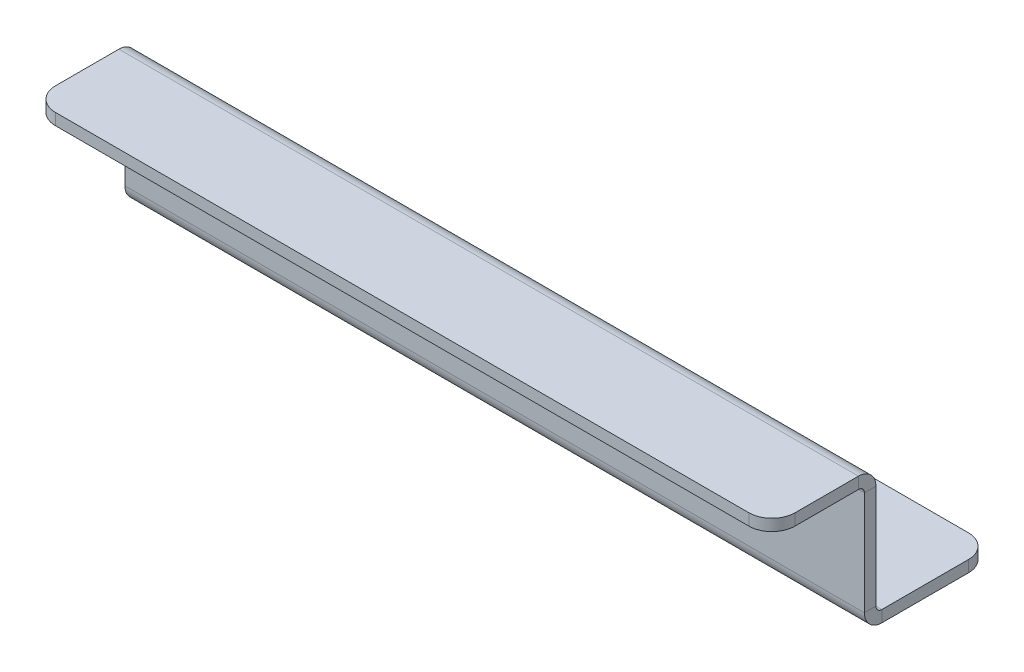
ISO-10303-21;
HEADER;
FILE_DESCRIPTION(('STEP AP214'),'2;1');
FILE_NAME('part.step','',(''),(''),'','','');
FILE_SCHEMA(('AUTOMOTIVE_DESIGN { 1 0 10303 214 1 1 1 1 }'));
ENDSEC;
DATA;
#1=APPLICATION_CONTEXT('core data for automotive mechanical design processes');
#2=APPLICATION_PROTOCOL_DEFINITION('international standard','automotive_design',2000,#1);
#3=PRODUCT_CONTEXT('',#1,'mechanical');
#4=PRODUCT('Part','Part','',(#3));
#5=PRODUCT_RELATED_PRODUCT_CATEGORY('part','',(#4));
#6=PRODUCT_DEFINITION_FORMATION('','',#4);
#7=PRODUCT_DEFINITION_CONTEXT('part definition',#1,'design');
#8=PRODUCT_DEFINITION('design','',#6,#7);
#9=PRODUCT_DEFINITION_SHAPE('','',#8);
#10=(LENGTH_UNIT() NAMED_UNIT(*) SI_UNIT(.MILLI.,.METRE.));
#11=(NAMED_UNIT(*) PLANE_ANGLE_UNIT() SI_UNIT($,.RADIAN.));
#12=(NAMED_UNIT(*) SI_UNIT($,.STERADIAN.) SOLID_ANGLE_UNIT());
#13=UNCERTAINTY_MEASURE_WITH_UNIT(LENGTH_MEASURE(1.E-05),#10,'distance_accuracy_value','');
#14=(GEOMETRIC_REPRESENTATION_CONTEXT(3) GLOBAL_UNCERTAINTY_ASSIGNED_CONTEXT((#13)) GLOBAL_UNIT_ASSIGNED_CONTEXT((#10,
#11,#12)) REPRESENTATION_CONTEXT('',''));
#15=CARTESIAN_POINT('',(0.,0.,0.));
#16=DIRECTION('',(0.,0.,1.));
#17=DIRECTION('',(1.,0.,0.));
#18=AXIS2_PLACEMENT_3D('',#15,#16,#17);
#19=CARTESIAN_POINT('',(50.8,2.4003,0.));
#20=DIRECTION('',(1.,0.,0.));
#21=DIRECTION('',(0.,0.,-1.));
#22=AXIS2_PLACEMENT_3D('',#19,#20,#21);
#23=PLANE('',#22);
#24=DIRECTION('',(0.,0.,-1.));
#25=VECTOR('',#24,1.);
#26=CARTESIAN_POINT('',(50.8,2.4003,0.));
#27=LINE('',#26,#25);
#28=CARTESIAN_POINT('',(50.8,2.4003,0.));
#29=VERTEX_POINT('',#28);
#30=CARTESIAN_POINT('',(50.8,2.4003,-1.5875));
#31=VERTEX_POINT('',#30);
#32=EDGE_CURVE('E425',#29,#31,#27,.T.);
#33=ORIENTED_EDGE('',*,*,#32,.F.);
#34=CARTESIAN_POINT('',(50.8,2.4003,-2.4003));
#35=DIRECTION('',(1.,0.,0.));
#36=DIRECTION('',(0.,0.,-1.));
#37=AXIS2_PLACEMENT_3D('',#34,#35,#36);
#38=CIRCLE('',#37,2.4003);
#39=CARTESIAN_POINT('',(50.8,0.,-2.4003));
#40=VERTEX_POINT('',#39);
#41=EDGE_CURVE('E342',#40,#29,#38,.F.);
#42=ORIENTED_EDGE('',*,*,#41,.F.);
#43=DIRECTION('',(0.,-1.,0.));
#44=VECTOR('',#43,1.);
#45=CARTESIAN_POINT('',(50.8,1.5875,-2.4003));
#46=LINE('',#45,#44);
#47=CARTESIAN_POINT('',(50.8,1.5875,-2.4003));
#48=VERTEX_POINT('',#47);
#49=EDGE_CURVE('E422',#48,#40,#46,.T.);
#50=ORIENTED_EDGE('',*,*,#49,.F.);
#51=CARTESIAN_POINT('',(50.8,2.4003,-2.4003));
#52=DIRECTION('',(1.,0.,0.));
#53=DIRECTION('',(0.,0.,-1.));
#54=AXIS2_PLACEMENT_3D('',#51,#52,#53);
#55=CIRCLE('',#54,0.8128);
#56=EDGE_CURVE('E352',#48,#31,#55,.F.);
#57=ORIENTED_EDGE('',*,*,#56,.T.);
#58=EDGE_LOOP('',(#33,#42,#50,#57));
#59=FACE_BOUND('',#58,.T.);
#60=ADVANCED_FACE('F192',(#59),#23,.T.);
#61=CARTESIAN_POINT('',(50.8,1.5875,-2.4003));
#62=DIRECTION('',(1.,0.,0.));
#63=DIRECTION('',(0.,0.,-1.));
#64=AXIS2_PLACEMENT_3D('',#61,#62,#63);
#65=PLANE('',#64);
#66=DIRECTION('',(0.,1.,0.));
#67=VECTOR('',#66,1.);
#68=CARTESIAN_POINT('',(50.8,0.,0.));
#69=LINE('',#68,#67);
#70=CARTESIAN_POINT('',(50.8,16.6624,0.));
#71=VERTEX_POINT('',#70);
#72=EDGE_CURVE('E340',#29,#71,#69,.T.);
#73=ORIENTED_EDGE('',*,*,#72,.F.);
#74=ORIENTED_EDGE('',*,*,#32,.T.);
#75=DIRECTION('',(0.,1.,0.));
#76=VECTOR('',#75,1.);
#77=CARTESIAN_POINT('',(50.8,0.,-1.5875));
#78=LINE('',#77,#76);
#79=CARTESIAN_POINT('',(50.8,16.6624,-1.5875));
#80=VERTEX_POINT('',#79);
#81=EDGE_CURVE('E355',#31,#80,#78,.T.);
#82=ORIENTED_EDGE('',*,*,#81,.T.);
#83=DIRECTION('',(0.,0.,1.));
#84=VECTOR('',#83,1.);
#85=CARTESIAN_POINT('',(50.8,16.6624,-1.5875));
#86=LINE('',#85,#84);
#87=EDGE_CURVE('E317',#80,#71,#86,.T.);
#88=ORIENTED_EDGE('',*,*,#87,.T.);
#89=EDGE_LOOP('',(#73,#74,#82,#88));
#90=FACE_BOUND('',#89,.T.);
#91=ADVANCED_FACE('F528',(#90),#65,.T.);
#92=CARTESIAN_POINT('',(-50.8,0.,-2.4003));
#93=DIRECTION('',(-1.,0.,0.));
#94=DIRECTION('',(0.,0.,1.));
#95=AXIS2_PLACEMENT_3D('',#92,#93,#94);
#96=PLANE('',#95);
#97=DIRECTION('',(0.,1.,0.));
#98=VECTOR('',#97,1.);
#99=CARTESIAN_POINT('',(-50.8,0.,-2.4003));
#100=LINE('',#99,#98);
#101=CARTESIAN_POINT('',(-50.8,0.,-2.4003));
#102=VERTEX_POINT('',#101);
#103=CARTESIAN_POINT('',(-50.8,1.5875,-2.4003));
#104=VERTEX_POINT('',#103);
#105=EDGE_CURVE('E419',#102,#104,#100,.T.);
#106=ORIENTED_EDGE('',*,*,#105,.F.);
#107=CARTESIAN_POINT('',(-50.8,2.4003,-2.4003));
#108=DIRECTION('',(1.,0.,0.));
#109=DIRECTION('',(0.,0.,-1.));
#110=AXIS2_PLACEMENT_3D('',#107,#108,#109);
#111=CIRCLE('',#110,2.4003);
#112=CARTESIAN_POINT('',(-50.8,2.4003,0.));
#113=VERTEX_POINT('',#112);
#114=EDGE_CURVE('E370',#102,#113,#111,.F.);
#115=ORIENTED_EDGE('',*,*,#114,.T.);
#116=DIRECTION('',(0.,0.,1.));
#117=VECTOR('',#116,1.);
#118=CARTESIAN_POINT('',(-50.8,2.4003,-1.5875));
#119=LINE('',#118,#117);
#120=CARTESIAN_POINT('',(-50.8,2.4003,-1.5875));
#121=VERTEX_POINT('',#120);
#122=EDGE_CURVE('E316',#121,#113,#119,.T.);
#123=ORIENTED_EDGE('',*,*,#122,.F.);
#124=CARTESIAN_POINT('',(-50.8,2.4003,-2.4003));
#125=DIRECTION('',(1.,0.,0.));
#126=DIRECTION('',(0.,0.,-1.));
#127=AXIS2_PLACEMENT_3D('',#124,#125,#126);
#128=CIRCLE('',#127,0.8128);
#129=EDGE_CURVE('E377',#104,#121,#128,.F.);
#130=ORIENTED_EDGE('',*,*,#129,.F.);
#131=EDGE_LOOP('',(#106,#115,#123,#130));
#132=FACE_BOUND('',#131,.T.);
#133=ADVANCED_FACE('F506',(#132),#96,.T.);
#134=CARTESIAN_POINT('',(-50.8,2.4003,-1.5875));
#135=DIRECTION('',(-1.,0.,0.));
#136=DIRECTION('',(0.,0.,1.));
#137=AXIS2_PLACEMENT_3D('',#134,#135,#136);
#138=PLANE('',#137);
#139=DIRECTION('',(0.,0.,-1.));
#140=VECTOR('',#139,1.);
#141=CARTESIAN_POINT('',(-50.8,1.5875,0.));
#142=LINE('',#141,#140);
#143=CARTESIAN_POINT('',(-50.8,1.5875,-14.3002));
#144=VERTEX_POINT('',#143);
#145=EDGE_CURVE('E375',#144,#104,#142,.F.);
#146=ORIENTED_EDGE('',*,*,#145,.F.);
#147=DIRECTION('',(0.,-1.,0.));
#148=VECTOR('',#147,1.);
#149=CARTESIAN_POINT('',(-50.8,2.4003,-14.3002));
#150=LINE('',#149,#148);
#151=CARTESIAN_POINT('',(-50.8,0.,-14.3002));
#152=VERTEX_POINT('',#151);
#153=EDGE_CURVE('E427',#144,#152,#150,.T.);
#154=ORIENTED_EDGE('',*,*,#153,.T.);
#155=DIRECTION('',(0.,0.,1.));
#156=VECTOR('',#155,1.);
#157=CARTESIAN_POINT('',(-50.8,0.,0.));
#158=LINE('',#157,#156);
#159=EDGE_CURVE('E373',#152,#102,#158,.T.);
#160=ORIENTED_EDGE('',*,*,#159,.T.);
#161=ORIENTED_EDGE('',*,*,#105,.T.);
#162=EDGE_LOOP('',(#146,#154,#160,#161));
#163=FACE_BOUND('',#162,.T.);
#164=ADVANCED_FACE('F502',(#163),#138,.T.);
#165=CARTESIAN_POINT('',(50.8,17.4752,0.8128));
#166=DIRECTION('',(1.,0.,0.));
#167=DIRECTION('',(0.,0.,-1.));
#168=AXIS2_PLACEMENT_3D('',#165,#166,#167);
#169=PLANE('',#168);
#170=DIRECTION('',(0.,1.,0.));
#171=VECTOR('',#170,1.);
#172=CARTESIAN_POINT('',(50.8,17.4752,0.8128));
#173=LINE('',#172,#171);
#174=CARTESIAN_POINT('',(50.8,17.4752,0.8128));
#175=VERTEX_POINT('',#174);
#176=CARTESIAN_POINT('',(50.8,19.0627,0.8128));
#177=VERTEX_POINT('',#176);
#178=EDGE_CURVE('E307',#175,#177,#173,.T.);
#179=ORIENTED_EDGE('',*,*,#178,.F.);
#180=CARTESIAN_POINT('',(50.8,16.6624,0.8128));
#181=DIRECTION('',(-1.,0.,0.));
#182=DIRECTION('',(0.,0.,1.));
#183=AXIS2_PLACEMENT_3D('',#180,#181,#182);
#184=CIRCLE('',#183,0.8128);
#185=EDGE_CURVE('E311',#71,#175,#184,.F.);
#186=ORIENTED_EDGE('',*,*,#185,.F.);
#187=ORIENTED_EDGE('',*,*,#87,.F.);
#188=CARTESIAN_POINT('',(50.8,16.6624,0.8128));
#189=DIRECTION('',(1.,0.,0.));
#190=DIRECTION('',(0.,0.,-1.));
#191=AXIS2_PLACEMENT_3D('',#188,#189,#190);
#192=CIRCLE('',#191,2.4003);
#193=EDGE_CURVE('E314',#80,#177,#192,.T.);
#194=ORIENTED_EDGE('',*,*,#193,.T.);
#195=EDGE_LOOP('',(#179,#186,#187,#194));
#196=FACE_BOUND('',#195,.T.);
#197=ADVANCED_FACE('F309',(#196),#169,.T.);
#198=CARTESIAN_POINT('',(50.8,16.6624,-1.5875));
#199=DIRECTION('',(1.,0.,0.));
#200=DIRECTION('',(0.,0.,-1.));
#201=AXIS2_PLACEMENT_3D('',#198,#199,#200);
#202=PLANE('',#201);
#203=DIRECTION('',(0.,0.,-1.));
#204=VECTOR('',#203,1.);
#205=CARTESIAN_POINT('',(50.8,19.0627,0.));
#206=LINE('',#205,#204);
#207=CARTESIAN_POINT('',(50.8,19.0627,9.525));
#208=VERTEX_POINT('',#207);
#209=EDGE_CURVE('E335',#177,#208,#206,.F.);
#210=ORIENTED_EDGE('',*,*,#209,.T.);
#211=DIRECTION('',(0.,1.,0.));
#212=VECTOR('',#211,1.);
#213=CARTESIAN_POINT('',(50.8,16.6624,9.525));
#214=LINE('',#213,#212);
#215=CARTESIAN_POINT('',(50.8,17.4752,9.525));
#216=VERTEX_POINT('',#215);
#217=EDGE_CURVE('E12',#208,#216,#214,.F.);
#218=ORIENTED_EDGE('',*,*,#217,.T.);
#219=DIRECTION('',(0.,0.,1.));
#220=VECTOR('',#219,1.);
#221=CARTESIAN_POINT('',(50.8,17.4752,0.));
#222=LINE('',#221,#220);
#223=EDGE_CURVE('E324',#175,#216,#222,.T.);
#224=ORIENTED_EDGE('',*,*,#223,.F.);
#225=ORIENTED_EDGE('',*,*,#178,.T.);
#226=EDGE_LOOP('',(#210,#218,#224,#225));
#227=FACE_BOUND('',#226,.T.);
#228=ADVANCED_FACE('F334',(#227),#202,.T.);
#229=CARTESIAN_POINT('',(-50.8,16.6624,0.));
#230=DIRECTION('',(-1.,0.,0.));
#231=DIRECTION('',(0.,0.,1.));
#232=AXIS2_PLACEMENT_3D('',#229,#230,#231);
#233=PLANE('',#232);
#234=DIRECTION('',(0.,0.,-1.));
#235=VECTOR('',#234,1.);
#236=CARTESIAN_POINT('',(-50.8,16.6624,0.));
#237=LINE('',#236,#235);
#238=CARTESIAN_POINT('',(-50.8,16.6624,0.));
#239=VERTEX_POINT('',#238);
#240=CARTESIAN_POINT('',(-50.8,16.6624,-1.5875));
#241=VERTEX_POINT('',#240);
#242=EDGE_CURVE('E415',#239,#241,#237,.T.);
#243=ORIENTED_EDGE('',*,*,#242,.F.);
#244=CARTESIAN_POINT('',(-50.8,16.6624,0.8128));
#245=DIRECTION('',(-1.,0.,0.));
#246=DIRECTION('',(0.,0.,1.));
#247=AXIS2_PLACEMENT_3D('',#244,#245,#246);
#248=CIRCLE('',#247,0.8128);
#249=CARTESIAN_POINT('',(-50.8,17.4752,0.8128));
#250=VERTEX_POINT('',#249);
#251=EDGE_CURVE('E365',#239,#250,#248,.F.);
#252=ORIENTED_EDGE('',*,*,#251,.T.);
#253=DIRECTION('',(0.,-1.,0.));
#254=VECTOR('',#253,1.);
#255=CARTESIAN_POINT('',(-50.8,19.0627,0.8128));
#256=LINE('',#255,#254);
#257=CARTESIAN_POINT('',(-50.8,19.0627,0.8128));
#258=VERTEX_POINT('',#257);
#259=EDGE_CURVE('E413',#258,#250,#256,.T.);
#260=ORIENTED_EDGE('',*,*,#259,.F.);
#261=CARTESIAN_POINT('',(-50.8,16.6624,0.8128));
#262=DIRECTION('',(1.,0.,0.));
#263=DIRECTION('',(0.,0.,-1.));
#264=AXIS2_PLACEMENT_3D('',#261,#262,#263);
#265=CIRCLE('',#264,2.4003);
#266=EDGE_CURVE('E383',#241,#258,#265,.T.);
#267=ORIENTED_EDGE('',*,*,#266,.F.);
#268=EDGE_LOOP('',(#243,#252,#260,#267));
#269=FACE_BOUND('',#268,.T.);
#270=ADVANCED_FACE('F522',(#269),#233,.T.);
#271=CARTESIAN_POINT('',(-50.8,19.0627,0.8128));
#272=DIRECTION('',(-1.,0.,0.));
#273=DIRECTION('',(0.,0.,1.));
#274=AXIS2_PLACEMENT_3D('',#271,#272,#273);
#275=PLANE('',#274);
#276=DIRECTION('',(0.,1.,0.));
#277=VECTOR('',#276,1.);
#278=CARTESIAN_POINT('',(-50.8,0.,0.));
#279=LINE('',#278,#277);
#280=EDGE_CURVE('E367',#113,#239,#279,.T.);
#281=ORIENTED_EDGE('',*,*,#280,.T.);
#282=ORIENTED_EDGE('',*,*,#242,.T.);
#283=DIRECTION('',(0.,1.,0.));
#284=VECTOR('',#283,1.);
#285=CARTESIAN_POINT('',(-50.8,0.,-1.5875));
#286=LINE('',#285,#284);
#287=EDGE_CURVE('E380',#121,#241,#286,.T.);
#288=ORIENTED_EDGE('',*,*,#287,.F.);
#289=ORIENTED_EDGE('',*,*,#122,.T.);
#290=EDGE_LOOP('',(#281,#282,#288,#289));
#291=FACE_BOUND('',#290,.T.);
#292=ADVANCED_FACE('F518',(#291),#275,.T.);
#293=CARTESIAN_POINT('',(50.8,19.0627,0.));
#294=DIRECTION('',(0.,-1.,0.));
#295=DIRECTION('',(0.,0.,-1.));
#296=AXIS2_PLACEMENT_3D('',#293,#294,#295);
#297=PLANE('',#296);
#298=DIRECTION('',(0.,0.,-1.));
#299=VECTOR('',#298,1.);
#300=CARTESIAN_POINT('',(-50.8,19.0627,0.));
#301=LINE('',#300,#299);
#302=CARTESIAN_POINT('',(-50.8,19.0627,9.525));
#303=VERTEX_POINT('',#302);
#304=EDGE_CURVE('E360',#258,#303,#301,.F.);
#305=ORIENTED_EDGE('',*,*,#304,.T.);
#306=CARTESIAN_POINT('',(-47.625,19.0627,9.525));
#307=DIRECTION('',(0.,-1.,0.));
#308=DIRECTION('',(0.,0.,-1.));
#309=AXIS2_PLACEMENT_3D('',#306,#307,#308);
#310=CIRCLE('',#309,3.175);
#311=CARTESIAN_POINT('',(-47.625,19.0627,12.7));
#312=VERTEX_POINT('',#311);
#313=EDGE_CURVE('E457',#303,#312,#310,.F.);
#314=ORIENTED_EDGE('',*,*,#313,.T.);
#315=DIRECTION('',(-1.,0.,0.));
#316=VECTOR('',#315,1.);
#317=CARTESIAN_POINT('',(50.8,19.0627,12.7));
#318=LINE('',#317,#316);
#319=CARTESIAN_POINT('',(47.625,19.0627,12.7));
#320=VERTEX_POINT('',#319);
#321=EDGE_CURVE('E411',#320,#312,#318,.T.);
#322=ORIENTED_EDGE('',*,*,#321,.F.);
#323=CARTESIAN_POINT('',(47.625,19.0627,9.525));
#324=DIRECTION('',(0.,-1.,0.));
#325=DIRECTION('',(0.,0.,-1.));
#326=AXIS2_PLACEMENT_3D('',#323,#324,#325);
#327=CIRCLE('',#326,3.175);
#328=EDGE_CURVE('E455',#320,#208,#327,.F.);
#329=ORIENTED_EDGE('',*,*,#328,.T.);
#330=ORIENTED_EDGE('',*,*,#209,.F.);
#331=DIRECTION('',(-1.,0.,0.));
#332=VECTOR('',#331,1.);
#333=CARTESIAN_POINT('',(50.8,19.0627,0.8128));
#334=LINE('',#333,#332);
#335=EDGE_CURVE('E359',#177,#258,#334,.T.);
#336=ORIENTED_EDGE('',*,*,#335,.T.);
#337=EDGE_LOOP('',(#305,#314,#322,#329,#330,#336));
#338=FACE_BOUND('',#337,.T.);
#339=ADVANCED_FACE('F473',(#338),#297,.F.);
#340=CARTESIAN_POINT('',(50.8,17.4752,12.7));
#341=DIRECTION('',(0.,0.,1.));
#342=DIRECTION('',(1.,0.,0.));
#343=AXIS2_PLACEMENT_3D('',#340,#341,#342);
#344=PLANE('',#343);
#345=ORIENTED_EDGE('',*,*,#321,.T.);
#346=DIRECTION('',(0.,1.,0.));
#347=VECTOR('',#346,1.);
#348=CARTESIAN_POINT('',(-47.625,17.4752,12.7));
#349=LINE('',#348,#347);
#350=CARTESIAN_POINT('',(-47.625,17.4752,12.7));
#351=VERTEX_POINT('',#350);
#352=EDGE_CURVE('E213',#312,#351,#349,.F.);
#353=ORIENTED_EDGE('',*,*,#352,.T.);
#354=DIRECTION('',(-1.,0.,0.));
#355=VECTOR('',#354,1.);
#356=CARTESIAN_POINT('',(50.8,17.4752,12.7));
#357=LINE('',#356,#355);
#358=CARTESIAN_POINT('',(47.625,17.4752,12.7));
#359=VERTEX_POINT('',#358);
#360=EDGE_CURVE('E331',#359,#351,#357,.T.);
#361=ORIENTED_EDGE('',*,*,#360,.F.);
#362=DIRECTION('',(0.,1.,0.));
#363=VECTOR('',#362,1.);
#364=CARTESIAN_POINT('',(47.625,17.4752,12.7));
#365=LINE('',#364,#363);
#366=EDGE_CURVE('E459',#359,#320,#365,.T.);
#367=ORIENTED_EDGE('',*,*,#366,.T.);
#368=EDGE_LOOP('',(#345,#353,#361,#367));
#369=FACE_BOUND('',#368,.T.);
#370=ADVANCED_FACE('F474',(#369),#344,.T.);
#371=CARTESIAN_POINT('',(50.8,17.4752,0.));
#372=DIRECTION('',(0.,-1.,0.));
#373=DIRECTION('',(0.,0.,-1.));
#374=AXIS2_PLACEMENT_3D('',#371,#372,#373);
#375=PLANE('',#374);
#376=ORIENTED_EDGE('',*,*,#360,.T.);
#377=CARTESIAN_POINT('',(-47.625,17.4752,9.525));
#378=DIRECTION('',(0.,-1.,0.));
#379=DIRECTION('',(0.,0.,-1.));
#380=AXIS2_PLACEMENT_3D('',#377,#378,#379);
#381=CIRCLE('',#380,3.175);
#382=CARTESIAN_POINT('',(-50.8,17.4752,9.525));
#383=VERTEX_POINT('',#382);
#384=EDGE_CURVE('E200',#351,#383,#381,.T.);
#385=ORIENTED_EDGE('',*,*,#384,.T.);
#386=DIRECTION('',(0.,0.,1.));
#387=VECTOR('',#386,1.);
#388=CARTESIAN_POINT('',(-50.8,17.4752,0.));
#389=LINE('',#388,#387);
#390=EDGE_CURVE('E327',#250,#383,#389,.T.);
#391=ORIENTED_EDGE('',*,*,#390,.F.);
#392=DIRECTION('',(-1.,0.,0.));
#393=VECTOR('',#392,1.);
#394=CARTESIAN_POINT('',(50.8,17.4752,0.8128));
#395=LINE('',#394,#393);
#396=EDGE_CURVE('E322',#175,#250,#395,.T.);
#397=ORIENTED_EDGE('',*,*,#396,.F.);
#398=ORIENTED_EDGE('',*,*,#223,.T.);
#399=CARTESIAN_POINT('',(47.625,17.4752,9.525));
#400=DIRECTION('',(0.,-1.,0.));
#401=DIRECTION('',(0.,0.,-1.));
#402=AXIS2_PLACEMENT_3D('',#399,#400,#401);
#403=CIRCLE('',#402,3.175);
#404=EDGE_CURVE('E463',#216,#359,#403,.T.);
#405=ORIENTED_EDGE('',*,*,#404,.T.);
#406=EDGE_LOOP('',(#376,#385,#391,#397,#398,#405));
#407=FACE_BOUND('',#406,.T.);
#408=ADVANCED_FACE('F323',(#407),#375,.T.);
#409=CARTESIAN_POINT('',(50.8,16.6624,0.8128));
#410=DIRECTION('',(-1.,0.,0.));
#411=DIRECTION('',(0.,0.,1.));
#412=AXIS2_PLACEMENT_3D('',#409,#410,#411);
#413=CYLINDRICAL_SURFACE('',#412,0.8128);
#414=ORIENTED_EDGE('',*,*,#251,.F.);
#415=DIRECTION('',(-1.,0.,0.));
#416=VECTOR('',#415,1.);
#417=CARTESIAN_POINT('',(50.8,16.6624,0.));
#418=LINE('',#417,#416);
#419=EDGE_CURVE('E332',#71,#239,#418,.T.);
#420=ORIENTED_EDGE('',*,*,#419,.F.);
#421=ORIENTED_EDGE('',*,*,#185,.T.);
#422=ORIENTED_EDGE('',*,*,#396,.T.);
#423=EDGE_LOOP('',(#414,#420,#421,#422));
#424=FACE_BOUND('',#423,.T.);
#425=ADVANCED_FACE('F338',(#424),#413,.F.);
#426=CARTESIAN_POINT('',(50.8,0.,0.));
#427=DIRECTION('',(0.,0.,1.));
#428=DIRECTION('',(1.,0.,0.));
#429=AXIS2_PLACEMENT_3D('',#426,#427,#428);
#430=PLANE('',#429);
#431=ORIENTED_EDGE('',*,*,#280,.F.);
#432=DIRECTION('',(-1.,0.,0.));
#433=VECTOR('',#432,1.);
#434=CARTESIAN_POINT('',(50.8,2.4003,0.));
#435=LINE('',#434,#433);
#436=EDGE_CURVE('E406',#29,#113,#435,.T.);
#437=ORIENTED_EDGE('',*,*,#436,.F.);
#438=ORIENTED_EDGE('',*,*,#72,.T.);
#439=ORIENTED_EDGE('',*,*,#419,.T.);
#440=EDGE_LOOP('',(#431,#437,#438,#439));
#441=FACE_BOUND('',#440,.T.);
#442=ADVANCED_FACE('F524',(#441),#430,.T.);
#443=CARTESIAN_POINT('',(50.8,2.4003,-2.4003));
#444=DIRECTION('',(-1.,0.,0.));
#445=DIRECTION('',(0.,0.,1.));
#446=AXIS2_PLACEMENT_3D('',#443,#444,#445);
#447=CYLINDRICAL_SURFACE('',#446,2.4003);
#448=ORIENTED_EDGE('',*,*,#114,.F.);
#449=DIRECTION('',(-1.,0.,0.));
#450=VECTOR('',#449,1.);
#451=CARTESIAN_POINT('',(50.8,0.,-2.4003));
#452=LINE('',#451,#450);
#453=EDGE_CURVE('E403',#40,#102,#452,.T.);
#454=ORIENTED_EDGE('',*,*,#453,.F.);
#455=ORIENTED_EDGE('',*,*,#41,.T.);
#456=ORIENTED_EDGE('',*,*,#436,.T.);
#457=EDGE_LOOP('',(#448,#454,#455,#456));
#458=FACE_BOUND('',#457,.T.);
#459=ADVANCED_FACE('F491',(#458),#447,.T.);
#460=CARTESIAN_POINT('',(50.8,0.,0.));
#461=DIRECTION('',(0.,-1.,0.));
#462=DIRECTION('',(0.,0.,-1.));
#463=AXIS2_PLACEMENT_3D('',#460,#461,#462);
#464=PLANE('',#463);
#465=CARTESIAN_POINT('',(-34.925,0.,-10.3124));
#466=DIRECTION('',(0.,-1.,0.));
#467=DIRECTION('',(0.,0.,-1.));
#468=AXIS2_PLACEMENT_3D('',#465,#466,#467);
#469=CIRCLE('',#468,2.7051);
#470=CARTESIAN_POINT('',(-34.925,0.,-13.0175));
#471=VERTEX_POINT('',#470);
#472=EDGE_CURVE('E434',#471,#471,#469,.T.);
#473=ORIENTED_EDGE('',*,*,#472,.F.);
#474=EDGE_LOOP('',(#473));
#475=FACE_BOUND('',#474,.T.);
#476=CARTESIAN_POINT('',(34.93262,0.,-10.3124));
#477=DIRECTION('',(0.,-1.,0.));
#478=DIRECTION('',(0.,0.,-1.));
#479=AXIS2_PLACEMENT_3D('',#476,#477,#478);
#480=CIRCLE('',#479,2.7051);
#481=CARTESIAN_POINT('',(34.93262,0.,-13.0175));
#482=VERTEX_POINT('',#481);
#483=EDGE_CURVE('E430',#482,#482,#480,.T.);
#484=ORIENTED_EDGE('',*,*,#483,.F.);
#485=EDGE_LOOP('',(#484));
#486=FACE_BOUND('',#485,.T.);
#487=ORIENTED_EDGE('',*,*,#159,.F.);
#488=CARTESIAN_POINT('',(-47.625,0.,-14.3002));
#489=DIRECTION('',(0.,-1.,0.));
#490=DIRECTION('',(0.,0.,-1.));
#491=AXIS2_PLACEMENT_3D('',#488,#489,#490);
#492=CIRCLE('',#491,3.175);
#493=CARTESIAN_POINT('',(-47.625,0.,-17.4752));
#494=VERTEX_POINT('',#493);
#495=EDGE_CURVE('E439',#152,#494,#492,.T.);
#496=ORIENTED_EDGE('',*,*,#495,.T.);
#497=DIRECTION('',(-1.,0.,0.));
#498=VECTOR('',#497,1.);
#499=CARTESIAN_POINT('',(50.8,0.,-17.4752));
#500=LINE('',#499,#498);
#501=CARTESIAN_POINT('',(47.625,0.,-17.4752));
#502=VERTEX_POINT('',#501);
#503=EDGE_CURVE('E400',#502,#494,#500,.T.);
#504=ORIENTED_EDGE('',*,*,#503,.F.);
#505=CARTESIAN_POINT('',(47.625,0.,-14.3002));
#506=DIRECTION('',(0.,-1.,0.));
#507=DIRECTION('',(0.,0.,-1.));
#508=AXIS2_PLACEMENT_3D('',#505,#506,#507);
#509=CIRCLE('',#508,3.175);
#510=CARTESIAN_POINT('',(50.8,0.,-14.3002));
#511=VERTEX_POINT('',#510);
#512=EDGE_CURVE('E437',#502,#511,#509,.T.);
#513=ORIENTED_EDGE('',*,*,#512,.T.);
#514=DIRECTION('',(0.,0.,1.));
#515=VECTOR('',#514,1.);
#516=CARTESIAN_POINT('',(50.8,0.,0.));
#517=LINE('',#516,#515);
#518=EDGE_CURVE('E348',#511,#40,#517,.T.);
#519=ORIENTED_EDGE('',*,*,#518,.T.);
#520=ORIENTED_EDGE('',*,*,#453,.T.);
#521=EDGE_LOOP('',(#487,#496,#504,#513,#519,#520));
#522=FACE_BOUND('',#521,.T.);
#523=ADVANCED_FACE('F487',(#475,#486,#522),#464,.T.);
#524=CARTESIAN_POINT('',(50.8,1.5875,-17.4752));
#525=DIRECTION('',(0.,0.,-1.));
#526=DIRECTION('',(-1.,0.,0.));
#527=AXIS2_PLACEMENT_3D('',#524,#525,#526);
#528=PLANE('',#527);
#529=ORIENTED_EDGE('',*,*,#503,.T.);
#530=DIRECTION('',(0.,-1.,0.));
#531=VECTOR('',#530,1.);
#532=CARTESIAN_POINT('',(-47.625,1.5875,-17.4752));
#533=LINE('',#532,#531);
#534=CARTESIAN_POINT('',(-47.625,1.5875,-17.4752));
#535=VERTEX_POINT('',#534);
#536=EDGE_CURVE('E444',#494,#535,#533,.F.);
#537=ORIENTED_EDGE('',*,*,#536,.T.);
#538=DIRECTION('',(-1.,0.,0.));
#539=VECTOR('',#538,1.);
#540=CARTESIAN_POINT('',(50.8,1.5875,-17.4752));
#541=LINE('',#540,#539);
#542=CARTESIAN_POINT('',(47.625,1.5875,-17.4752));
#543=VERTEX_POINT('',#542);
#544=EDGE_CURVE('E397',#543,#535,#541,.T.);
#545=ORIENTED_EDGE('',*,*,#544,.F.);
#546=DIRECTION('',(0.,-1.,0.));
#547=VECTOR('',#546,1.);
#548=CARTESIAN_POINT('',(47.625,0.,-17.4752));
#549=LINE('',#548,#547);
#550=EDGE_CURVE('E441',#543,#502,#549,.T.);
#551=ORIENTED_EDGE('',*,*,#550,.T.);
#552=EDGE_LOOP('',(#529,#537,#545,#551));
#553=FACE_BOUND('',#552,.T.);
#554=ADVANCED_FACE('F490',(#553),#528,.T.);
#555=CARTESIAN_POINT('',(50.8,1.5875,0.));
#556=DIRECTION('',(0.,-1.,0.));
#557=DIRECTION('',(0.,0.,-1.));
#558=AXIS2_PLACEMENT_3D('',#555,#556,#557);
#559=PLANE('',#558);
#560=CARTESIAN_POINT('',(-34.925,1.5875,-10.3124));
#561=DIRECTION('',(0.,-1.,0.));
#562=DIRECTION('',(0.,0.,-1.));
#563=AXIS2_PLACEMENT_3D('',#560,#561,#562);
#564=CIRCLE('',#563,2.7051);
#565=CARTESIAN_POINT('',(-34.925,1.5875,-13.0175));
#566=VERTEX_POINT('',#565);
#567=EDGE_CURVE('E431',#566,#566,#564,.T.);
#568=ORIENTED_EDGE('',*,*,#567,.T.);
#569=EDGE_LOOP('',(#568));
#570=FACE_BOUND('',#569,.T.);
#571=CARTESIAN_POINT('',(34.93262,1.5875,-10.3124));
#572=DIRECTION('',(0.,-1.,0.));
#573=DIRECTION('',(0.,0.,-1.));
#574=AXIS2_PLACEMENT_3D('',#571,#572,#573);
#575=CIRCLE('',#574,2.7051);
#576=CARTESIAN_POINT('',(34.93262,1.5875,-13.0175));
#577=VERTEX_POINT('',#576);
#578=EDGE_CURVE('E363',#577,#577,#575,.T.);
#579=ORIENTED_EDGE('',*,*,#578,.T.);
#580=EDGE_LOOP('',(#579));
#581=FACE_BOUND('',#580,.T.);
#582=ORIENTED_EDGE('',*,*,#544,.T.);
#583=CARTESIAN_POINT('',(-47.625,1.5875,-14.3002));
#584=DIRECTION('',(0.,-1.,0.));
#585=DIRECTION('',(0.,0.,-1.));
#586=AXIS2_PLACEMENT_3D('',#583,#584,#585);
#587=CIRCLE('',#586,3.175);
#588=EDGE_CURVE('E448',#535,#144,#587,.F.);
#589=ORIENTED_EDGE('',*,*,#588,.T.);
#590=ORIENTED_EDGE('',*,*,#145,.T.);
#591=DIRECTION('',(-1.,0.,0.));
#592=VECTOR('',#591,1.);
#593=CARTESIAN_POINT('',(50.8,1.5875,-2.4003));
#594=LINE('',#593,#592);
#595=EDGE_CURVE('E394',#48,#104,#594,.T.);
#596=ORIENTED_EDGE('',*,*,#595,.F.);
#597=DIRECTION('',(0.,0.,-1.));
#598=VECTOR('',#597,1.);
#599=CARTESIAN_POINT('',(50.8,1.5875,0.));
#600=LINE('',#599,#598);
#601=CARTESIAN_POINT('',(50.8,1.5875,-14.3002));
#602=VERTEX_POINT('',#601);
#603=EDGE_CURVE('E350',#602,#48,#600,.F.);
#604=ORIENTED_EDGE('',*,*,#603,.F.);
#605=CARTESIAN_POINT('',(47.625,1.5875,-14.3002));
#606=DIRECTION('',(0.,-1.,0.));
#607=DIRECTION('',(0.,0.,-1.));
#608=AXIS2_PLACEMENT_3D('',#605,#606,#607);
#609=CIRCLE('',#608,3.175);
#610=EDGE_CURVE('E446',#602,#543,#609,.F.);
#611=ORIENTED_EDGE('',*,*,#610,.T.);
#612=EDGE_LOOP('',(#582,#589,#590,#596,#604,#611));
#613=FACE_BOUND('',#612,.T.);
#614=ADVANCED_FACE('F537',(#570,#581,#613),#559,.F.);
#615=CARTESIAN_POINT('',(50.8,2.4003,-2.4003));
#616=DIRECTION('',(-1.,0.,0.));
#617=DIRECTION('',(0.,0.,1.));
#618=AXIS2_PLACEMENT_3D('',#615,#616,#617);
#619=CYLINDRICAL_SURFACE('',#618,0.8128);
#620=ORIENTED_EDGE('',*,*,#129,.T.);
#621=DIRECTION('',(-1.,0.,0.));
#622=VECTOR('',#621,1.);
#623=CARTESIAN_POINT('',(50.8,2.4003,-1.5875));
#624=LINE('',#623,#622);
#625=EDGE_CURVE('E391',#31,#121,#624,.T.);
#626=ORIENTED_EDGE('',*,*,#625,.F.);
#627=ORIENTED_EDGE('',*,*,#56,.F.);
#628=ORIENTED_EDGE('',*,*,#595,.T.);
#629=EDGE_LOOP('',(#620,#626,#627,#628));
#630=FACE_BOUND('',#629,.T.);
#631=ADVANCED_FACE('F509',(#630),#619,.F.);
#632=CARTESIAN_POINT('',(50.8,0.,-1.5875));
#633=DIRECTION('',(0.,0.,1.));
#634=DIRECTION('',(1.,0.,0.));
#635=AXIS2_PLACEMENT_3D('',#632,#633,#634);
#636=PLANE('',#635);
#637=ORIENTED_EDGE('',*,*,#287,.T.);
#638=DIRECTION('',(-1.,0.,0.));
#639=VECTOR('',#638,1.);
#640=CARTESIAN_POINT('',(50.8,16.6624,-1.5875));
#641=LINE('',#640,#639);
#642=EDGE_CURVE('E388',#80,#241,#641,.T.);
#643=ORIENTED_EDGE('',*,*,#642,.F.);
#644=ORIENTED_EDGE('',*,*,#81,.F.);
#645=ORIENTED_EDGE('',*,*,#625,.T.);
#646=EDGE_LOOP('',(#637,#643,#644,#645));
#647=FACE_BOUND('',#646,.T.);
#648=ADVANCED_FACE('F515',(#647),#636,.F.);
#649=CARTESIAN_POINT('',(50.8,16.6624,0.8128));
#650=DIRECTION('',(-1.,0.,0.));
#651=DIRECTION('',(0.,0.,1.));
#652=AXIS2_PLACEMENT_3D('',#649,#650,#651);
#653=CYLINDRICAL_SURFACE('',#652,2.4003);
#654=ORIENTED_EDGE('',*,*,#266,.T.);
#655=ORIENTED_EDGE('',*,*,#335,.F.);
#656=ORIENTED_EDGE('',*,*,#193,.F.);
#657=ORIENTED_EDGE('',*,*,#642,.T.);
#658=EDGE_LOOP('',(#654,#655,#656,#657));
#659=FACE_BOUND('',#658,.T.);
#660=ADVANCED_FACE('F551',(#659),#653,.T.);
#661=CARTESIAN_POINT('',(50.8,16.6624,0.8128));
#662=DIRECTION('',(-1.,0.,0.));
#663=DIRECTION('',(0.,0.,1.));
#664=AXIS2_PLACEMENT_3D('',#661,#662,#663);
#665=PLANE('',#664);
#666=ORIENTED_EDGE('',*,*,#518,.F.);
#667=DIRECTION('',(0.,-1.,0.));
#668=VECTOR('',#667,1.);
#669=CARTESIAN_POINT('',(50.8,1.5875,-14.3002));
#670=LINE('',#669,#668);
#671=EDGE_CURVE('E450',#511,#602,#670,.F.);
#672=ORIENTED_EDGE('',*,*,#671,.T.);
#673=ORIENTED_EDGE('',*,*,#603,.T.);
#674=ORIENTED_EDGE('',*,*,#49,.T.);
#675=EDGE_LOOP('',(#666,#672,#673,#674));
#676=FACE_BOUND('',#675,.T.);
#677=ADVANCED_FACE('F549',(#676),#665,.F.);
#678=CARTESIAN_POINT('',(-50.8,16.6624,0.8128));
#679=DIRECTION('',(-1.,0.,0.));
#680=DIRECTION('',(0.,0.,1.));
#681=AXIS2_PLACEMENT_3D('',#678,#679,#680);
#682=PLANE('',#681);
#683=ORIENTED_EDGE('',*,*,#390,.T.);
#684=DIRECTION('',(0.,1.,0.));
#685=VECTOR('',#684,1.);
#686=CARTESIAN_POINT('',(-50.8,16.6624,9.525));
#687=LINE('',#686,#685);
#688=EDGE_CURVE('E452',#383,#303,#687,.T.);
#689=ORIENTED_EDGE('',*,*,#688,.T.);
#690=ORIENTED_EDGE('',*,*,#304,.F.);
#691=ORIENTED_EDGE('',*,*,#259,.T.);
#692=EDGE_LOOP('',(#683,#689,#690,#691));
#693=FACE_BOUND('',#692,.T.);
#694=ADVANCED_FACE('F468',(#693),#682,.T.);
#695=CARTESIAN_POINT('',(34.93262,2.54,-10.3124));
#696=DIRECTION('',(0.,-1.,0.));
#697=DIRECTION('',(0.,0.,-1.));
#698=AXIS2_PLACEMENT_3D('',#695,#696,#697);
#699=CYLINDRICAL_SURFACE('',#698,2.7051);
#700=ORIENTED_EDGE('',*,*,#483,.T.);
#701=EDGE_LOOP('',(#700));
#702=FACE_BOUND('',#701,.T.);
#703=ORIENTED_EDGE('',*,*,#578,.F.);
#704=EDGE_LOOP('',(#703));
#705=FACE_BOUND('',#704,.T.);
#706=ADVANCED_FACE('F557',(#702,#705),#699,.F.);
#707=CARTESIAN_POINT('',(-34.925,2.54,-10.3124));
#708=DIRECTION('',(0.,-1.,0.));
#709=DIRECTION('',(0.,0.,-1.));
#710=AXIS2_PLACEMENT_3D('',#707,#708,#709);
#711=CYLINDRICAL_SURFACE('',#710,2.7051);
#712=ORIENTED_EDGE('',*,*,#472,.T.);
#713=EDGE_LOOP('',(#712));
#714=FACE_BOUND('',#713,.T.);
#715=ORIENTED_EDGE('',*,*,#567,.F.);
#716=EDGE_LOOP('',(#715));
#717=FACE_BOUND('',#716,.T.);
#718=ADVANCED_FACE('F484',(#714,#717),#711,.F.);
#719=CARTESIAN_POINT('',(-47.625,2.4003,-14.3002));
#720=DIRECTION('',(0.,-1.,0.));
#721=DIRECTION('',(0.,0.,-1.));
#722=AXIS2_PLACEMENT_3D('',#719,#720,#721);
#723=CYLINDRICAL_SURFACE('',#722,3.175);
#724=ORIENTED_EDGE('',*,*,#588,.F.);
#725=ORIENTED_EDGE('',*,*,#536,.F.);
#726=ORIENTED_EDGE('',*,*,#495,.F.);
#727=ORIENTED_EDGE('',*,*,#153,.F.);
#728=EDGE_LOOP('',(#724,#725,#726,#727));
#729=FACE_BOUND('',#728,.T.);
#730=ADVANCED_FACE('F541',(#729),#723,.T.);
#731=CARTESIAN_POINT('',(47.625,1.5875,-14.3002));
#732=DIRECTION('',(0.,1.,0.));
#733=DIRECTION('',(0.,0.,1.));
#734=AXIS2_PLACEMENT_3D('',#731,#732,#733);
#735=CYLINDRICAL_SURFACE('',#734,3.175);
#736=ORIENTED_EDGE('',*,*,#610,.F.);
#737=ORIENTED_EDGE('',*,*,#671,.F.);
#738=ORIENTED_EDGE('',*,*,#512,.F.);
#739=ORIENTED_EDGE('',*,*,#550,.F.);
#740=EDGE_LOOP('',(#736,#737,#738,#739));
#741=FACE_BOUND('',#740,.T.);
#742=ADVANCED_FACE('F548',(#741),#735,.T.);
#743=CARTESIAN_POINT('',(-47.625,16.6624,9.525));
#744=DIRECTION('',(0.,1.,0.));
#745=DIRECTION('',(0.,0.,1.));
#746=AXIS2_PLACEMENT_3D('',#743,#744,#745);
#747=CYLINDRICAL_SURFACE('',#746,3.175);
#748=ORIENTED_EDGE('',*,*,#384,.F.);
#749=ORIENTED_EDGE('',*,*,#352,.F.);
#750=ORIENTED_EDGE('',*,*,#313,.F.);
#751=ORIENTED_EDGE('',*,*,#688,.F.);
#752=EDGE_LOOP('',(#748,#749,#750,#751));
#753=FACE_BOUND('',#752,.T.);
#754=ADVANCED_FACE('F470',(#753),#747,.T.);
#755=CARTESIAN_POINT('',(47.625,17.4752,9.525));
#756=DIRECTION('',(0.,1.,0.));
#757=DIRECTION('',(0.,0.,1.));
#758=AXIS2_PLACEMENT_3D('',#755,#756,#757);
#759=CYLINDRICAL_SURFACE('',#758,3.175);
#760=ORIENTED_EDGE('',*,*,#404,.F.);
#761=ORIENTED_EDGE('',*,*,#217,.F.);
#762=ORIENTED_EDGE('',*,*,#328,.F.);
#763=ORIENTED_EDGE('',*,*,#366,.F.);
#764=EDGE_LOOP('',(#760,#761,#762,#763));
#765=FACE_BOUND('',#764,.T.);
#766=ADVANCED_FACE('F194',(#765),#759,.T.);
#767=CLOSED_SHELL('',(#60,#91,#133,#164,#197,#228,#270,#292,#339,#370,#408,#425,#442,#459,#523,
#554,#614,#631,#648,#660,#677,#694,#706,#718,#730,#742,#754,#766));
#768=MANIFOLD_SOLID_BREP('B2',#767);
#769=ADVANCED_BREP_SHAPE_REPRESENTATION('',(#18,#768),#14);
#770=SHAPE_DEFINITION_REPRESENTATION(#9,#769);
ENDSEC;
END-ISO-10303-21;
